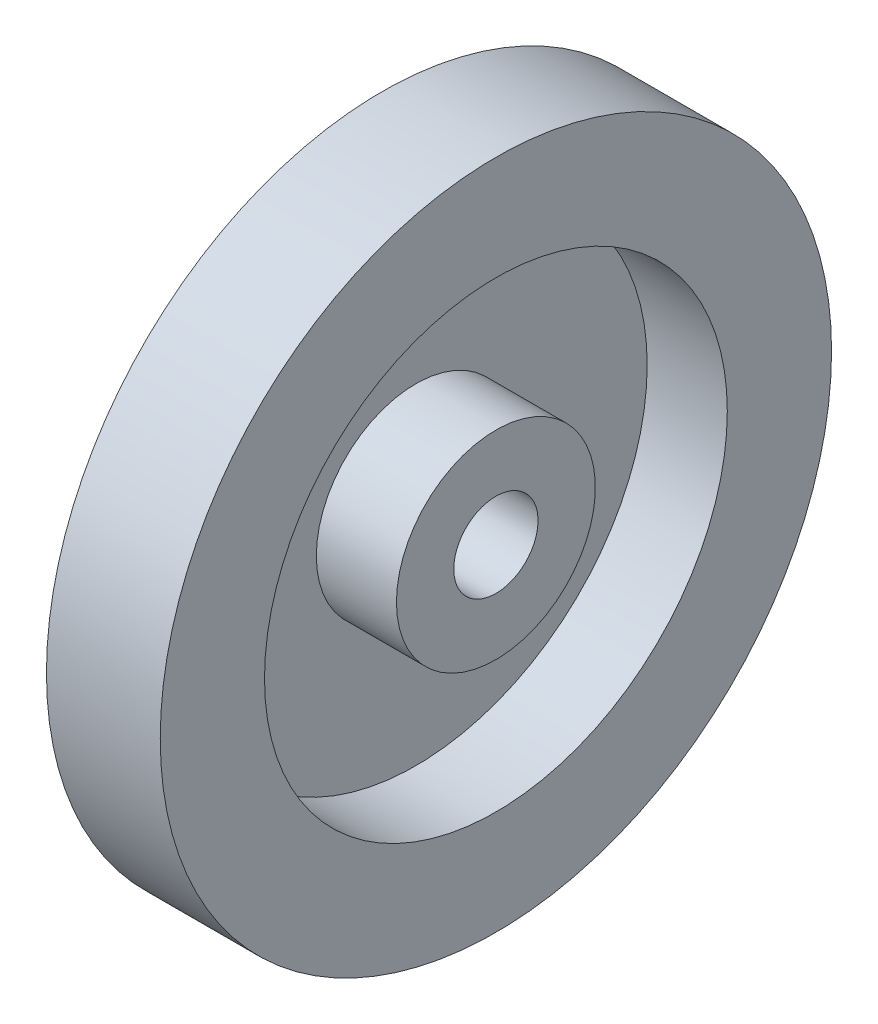
ISO-10303-21;
HEADER;
FILE_DESCRIPTION(('STEP AP214'),'2;1');
FILE_NAME('part.step','',(''),(''),'','','');
FILE_SCHEMA(('AUTOMOTIVE_DESIGN { 1 0 10303 214 1 1 1 1 }'));
ENDSEC;
DATA;
#1=APPLICATION_CONTEXT('core data for automotive mechanical design processes');
#2=APPLICATION_PROTOCOL_DEFINITION('international standard','automotive_design',2000,#1);
#3=PRODUCT_CONTEXT('',#1,'mechanical');
#4=PRODUCT('Part','Part','',(#3));
#5=PRODUCT_RELATED_PRODUCT_CATEGORY('part','',(#4));
#6=PRODUCT_DEFINITION_FORMATION('','',#4);
#7=PRODUCT_DEFINITION_CONTEXT('part definition',#1,'design');
#8=PRODUCT_DEFINITION('design','',#6,#7);
#9=PRODUCT_DEFINITION_SHAPE('','',#8);
#10=(LENGTH_UNIT() NAMED_UNIT(*) SI_UNIT(.MILLI.,.METRE.));
#11=(NAMED_UNIT(*) PLANE_ANGLE_UNIT() SI_UNIT($,.RADIAN.));
#12=(NAMED_UNIT(*) SI_UNIT($,.STERADIAN.) SOLID_ANGLE_UNIT());
#13=UNCERTAINTY_MEASURE_WITH_UNIT(LENGTH_MEASURE(1.E-05),#10,'distance_accuracy_value','');
#14=(GEOMETRIC_REPRESENTATION_CONTEXT(3) GLOBAL_UNCERTAINTY_ASSIGNED_CONTEXT((#13)) GLOBAL_UNIT_ASSIGNED_CONTEXT((#10,
#11,#12)) REPRESENTATION_CONTEXT('',''));
#15=CARTESIAN_POINT('',(0.,0.,0.));
#16=DIRECTION('',(0.,0.,1.));
#17=DIRECTION('',(1.,0.,0.));
#18=AXIS2_PLACEMENT_3D('',#15,#16,#17);
#19=CARTESIAN_POINT('',(0.,0.,0.));
#20=DIRECTION('',(-1.,0.,0.));
#21=DIRECTION('',(0.,0.,1.));
#22=AXIS2_PLACEMENT_3D('',#19,#20,#21);
#23=CYLINDRICAL_SURFACE('',#22,20.);
#24=CARTESIAN_POINT('',(0.,0.,0.));
#25=DIRECTION('',(-1.,0.,0.));
#26=DIRECTION('',(0.,0.,1.));
#27=AXIS2_PLACEMENT_3D('',#24,#25,#26);
#28=CIRCLE('',#27,20.);
#29=CARTESIAN_POINT('',(0.,0.,20.));
#30=VERTEX_POINT('',#29);
#31=EDGE_CURVE('E10',#30,#30,#28,.T.);
#32=ORIENTED_EDGE('',*,*,#31,.T.);
#33=EDGE_LOOP('',(#32));
#34=FACE_BOUND('',#33,.T.);
#35=CARTESIAN_POINT('',(54.0163576811065,0.,0.));
#36=DIRECTION('',(-1.,0.,0.));
#37=DIRECTION('',(0.,0.,1.));
#38=AXIS2_PLACEMENT_3D('',#35,#36,#37);
#39=CIRCLE('',#38,20.);
#40=CARTESIAN_POINT('',(54.0163576811065,0.,20.));
#41=VERTEX_POINT('',#40);
#42=EDGE_CURVE('E76',#41,#41,#39,.T.);
#43=ORIENTED_EDGE('',*,*,#42,.F.);
#44=EDGE_LOOP('',(#43));
#45=FACE_BOUND('',#44,.T.);
#46=ADVANCED_FACE('F41',(#34,#45),#23,.F.);
#47=CARTESIAN_POINT('',(0.,20.,0.));
#48=DIRECTION('',(-1.,0.,0.));
#49=DIRECTION('',(0.,0.,1.));
#50=AXIS2_PLACEMENT_3D('',#47,#48,#49);
#51=PLANE('',#50);
#52=CARTESIAN_POINT('',(0.,0.,0.));
#53=DIRECTION('',(-1.,0.,0.));
#54=DIRECTION('',(0.,0.,1.));
#55=AXIS2_PLACEMENT_3D('',#52,#53,#54);
#56=CIRCLE('',#55,159.326308126043);
#57=CARTESIAN_POINT('',(0.,0.,159.326308126043));
#58=VERTEX_POINT('',#57);
#59=EDGE_CURVE('E48',#58,#58,#56,.T.);
#60=ORIENTED_EDGE('',*,*,#59,.T.);
#61=EDGE_LOOP('',(#60));
#62=FACE_BOUND('',#61,.T.);
#63=ORIENTED_EDGE('',*,*,#31,.F.);
#64=EDGE_LOOP('',(#63));
#65=FACE_BOUND('',#64,.T.);
#66=ADVANCED_FACE('F85',(#62,#65),#51,.T.);
#67=CARTESIAN_POINT('',(0.,0.,0.));
#68=DIRECTION('',(-1.,0.,0.));
#69=DIRECTION('',(0.,0.,1.));
#70=AXIS2_PLACEMENT_3D('',#67,#68,#69);
#71=CYLINDRICAL_SURFACE('',#70,159.326308126043);
#72=CARTESIAN_POINT('',(54.0163576811064,0.,0.));
#73=DIRECTION('',(-1.,0.,0.));
#74=DIRECTION('',(0.,0.,1.));
#75=AXIS2_PLACEMENT_3D('',#72,#73,#74);
#76=CIRCLE('',#75,159.326308126043);
#77=CARTESIAN_POINT('',(54.0163576811064,0.,159.326308126043));
#78=VERTEX_POINT('',#77);
#79=EDGE_CURVE('E53',#78,#78,#76,.T.);
#80=ORIENTED_EDGE('',*,*,#79,.T.);
#81=EDGE_LOOP('',(#80));
#82=FACE_BOUND('',#81,.T.);
#83=ORIENTED_EDGE('',*,*,#59,.F.);
#84=EDGE_LOOP('',(#83));
#85=FACE_BOUND('',#84,.T.);
#86=ADVANCED_FACE('F89',(#82,#85),#71,.T.);
#87=CARTESIAN_POINT('',(54.0163576811064,159.326308126043,0.));
#88=DIRECTION('',(1.,0.,0.));
#89=DIRECTION('',(0.,0.,-1.));
#90=AXIS2_PLACEMENT_3D('',#87,#88,#89);
#91=PLANE('',#90);
#92=CARTESIAN_POINT('',(54.0163576811064,0.,0.));
#93=DIRECTION('',(-1.,0.,0.));
#94=DIRECTION('',(0.,0.,1.));
#95=AXIS2_PLACEMENT_3D('',#92,#93,#94);
#96=CIRCLE('',#95,109.840732834388);
#97=CARTESIAN_POINT('',(54.0163576811064,0.,109.840732834388));
#98=VERTEX_POINT('',#97);
#99=EDGE_CURVE('E58',#98,#98,#96,.T.);
#100=ORIENTED_EDGE('',*,*,#99,.T.);
#101=EDGE_LOOP('',(#100));
#102=FACE_BOUND('',#101,.T.);
#103=ORIENTED_EDGE('',*,*,#79,.F.);
#104=EDGE_LOOP('',(#103));
#105=FACE_BOUND('',#104,.T.);
#106=ADVANCED_FACE('F93',(#102,#105),#91,.T.);
#107=CARTESIAN_POINT('',(0.,0.,0.));
#108=DIRECTION('',(-1.,0.,0.));
#109=DIRECTION('',(0.,0.,1.));
#110=AXIS2_PLACEMENT_3D('',#107,#108,#109);
#111=CYLINDRICAL_SURFACE('',#110,109.840732834388);
#112=CARTESIAN_POINT('',(15.987304294293,0.,0.));
#113=DIRECTION('',(-1.,0.,0.));
#114=DIRECTION('',(0.,0.,1.));
#115=AXIS2_PLACEMENT_3D('',#112,#113,#114);
#116=CIRCLE('',#115,109.840732834388);
#117=CARTESIAN_POINT('',(15.987304294293,0.,109.840732834388));
#118=VERTEX_POINT('',#117);
#119=EDGE_CURVE('E64',#118,#118,#116,.T.);
#120=ORIENTED_EDGE('',*,*,#119,.T.);
#121=EDGE_LOOP('',(#120));
#122=FACE_BOUND('',#121,.T.);
#123=ORIENTED_EDGE('',*,*,#99,.F.);
#124=EDGE_LOOP('',(#123));
#125=FACE_BOUND('',#124,.T.);
#126=ADVANCED_FACE('F100',(#122,#125),#111,.F.);
#127=CARTESIAN_POINT('',(15.987304294293,109.840732834388,0.));
#128=DIRECTION('',(1.,0.,0.));
#129=DIRECTION('',(0.,0.,-1.));
#130=AXIS2_PLACEMENT_3D('',#127,#128,#129);
#131=PLANE('',#130);
#132=CARTESIAN_POINT('',(15.987304294293,0.,0.));
#133=DIRECTION('',(-1.,0.,0.));
#134=DIRECTION('',(0.,0.,1.));
#135=AXIS2_PLACEMENT_3D('',#132,#133,#134);
#136=CIRCLE('',#135,47.2139586304854);
#137=CARTESIAN_POINT('',(15.987304294293,0.,47.2139586304854));
#138=VERTEX_POINT('',#137);
#139=EDGE_CURVE('E68',#138,#138,#136,.T.);
#140=ORIENTED_EDGE('',*,*,#139,.T.);
#141=EDGE_LOOP('',(#140));
#142=FACE_BOUND('',#141,.T.);
#143=ORIENTED_EDGE('',*,*,#119,.F.);
#144=EDGE_LOOP('',(#143));
#145=FACE_BOUND('',#144,.T.);
#146=ADVANCED_FACE('F104',(#142,#145),#131,.T.);
#147=CARTESIAN_POINT('',(0.,0.,0.));
#148=DIRECTION('',(-1.,0.,0.));
#149=DIRECTION('',(0.,0.,1.));
#150=AXIS2_PLACEMENT_3D('',#147,#148,#149);
#151=CYLINDRICAL_SURFACE('',#150,47.2139586304854);
#152=CARTESIAN_POINT('',(54.0163576811065,0.,0.));
#153=DIRECTION('',(-1.,0.,0.));
#154=DIRECTION('',(0.,0.,1.));
#155=AXIS2_PLACEMENT_3D('',#152,#153,#154);
#156=CIRCLE('',#155,47.2139586304854);
#157=CARTESIAN_POINT('',(54.0163576811065,0.,47.2139586304854));
#158=VERTEX_POINT('',#157);
#159=EDGE_CURVE('E72',#158,#158,#156,.T.);
#160=ORIENTED_EDGE('',*,*,#159,.T.);
#161=EDGE_LOOP('',(#160));
#162=FACE_BOUND('',#161,.T.);
#163=ORIENTED_EDGE('',*,*,#139,.F.);
#164=EDGE_LOOP('',(#163));
#165=FACE_BOUND('',#164,.T.);
#166=ADVANCED_FACE('F108',(#162,#165),#151,.T.);
#167=CARTESIAN_POINT('',(54.0163576811065,47.2139586304854,0.));
#168=DIRECTION('',(1.,0.,0.));
#169=DIRECTION('',(0.,0.,-1.));
#170=AXIS2_PLACEMENT_3D('',#167,#168,#169);
#171=PLANE('',#170);
#172=ORIENTED_EDGE('',*,*,#42,.T.);
#173=EDGE_LOOP('',(#172));
#174=FACE_BOUND('',#173,.T.);
#175=ORIENTED_EDGE('',*,*,#159,.F.);
#176=EDGE_LOOP('',(#175));
#177=FACE_BOUND('',#176,.T.);
#178=ADVANCED_FACE('F81',(#174,#177),#171,.T.);
#179=CLOSED_SHELL('',(#46,#66,#86,#106,#126,#146,#166,#178));
#180=MANIFOLD_SOLID_BREP('B2',#179);
#181=ADVANCED_BREP_SHAPE_REPRESENTATION('',(#18,#180),#14);
#182=SHAPE_DEFINITION_REPRESENTATION(#9,#181);
ENDSEC;
END-ISO-10303-21;
